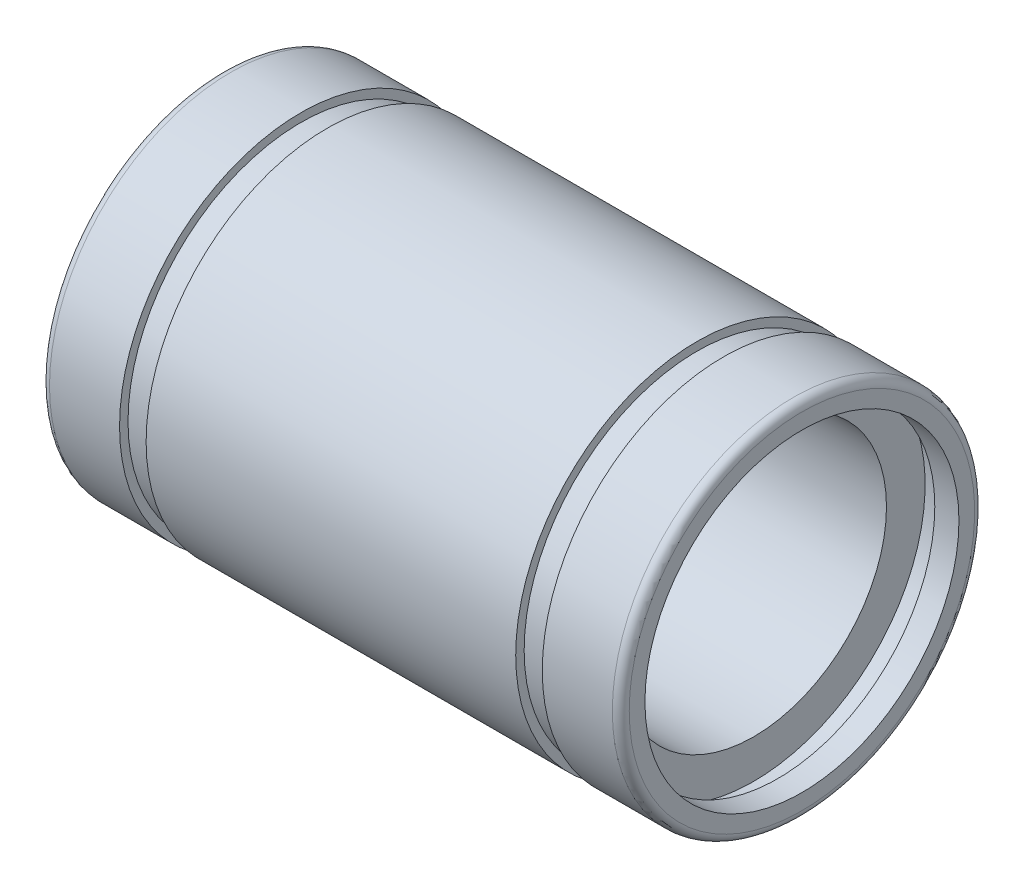
ISO-10303-21;
HEADER;
FILE_DESCRIPTION(('STEP AP214'),'2;1');
FILE_NAME('part.step','',(''),(''),'','','');
FILE_SCHEMA(('AUTOMOTIVE_DESIGN { 1 0 10303 214 1 1 1 1 }'));
ENDSEC;
DATA;
#1=APPLICATION_CONTEXT('core data for automotive mechanical design processes');
#2=APPLICATION_PROTOCOL_DEFINITION('international standard','automotive_design',2000,#1);
#3=PRODUCT_CONTEXT('',#1,'mechanical');
#4=PRODUCT('Part','Part','',(#3));
#5=PRODUCT_RELATED_PRODUCT_CATEGORY('part','',(#4));
#6=PRODUCT_DEFINITION_FORMATION('','',#4);
#7=PRODUCT_DEFINITION_CONTEXT('part definition',#1,'design');
#8=PRODUCT_DEFINITION('design','',#6,#7);
#9=PRODUCT_DEFINITION_SHAPE('','',#8);
#10=(LENGTH_UNIT() NAMED_UNIT(*) SI_UNIT(.MILLI.,.METRE.));
#11=(NAMED_UNIT(*) PLANE_ANGLE_UNIT() SI_UNIT($,.RADIAN.));
#12=(NAMED_UNIT(*) SI_UNIT($,.STERADIAN.) SOLID_ANGLE_UNIT());
#13=UNCERTAINTY_MEASURE_WITH_UNIT(LENGTH_MEASURE(1.E-05),#10,'distance_accuracy_value','');
#14=(GEOMETRIC_REPRESENTATION_CONTEXT(3) GLOBAL_UNCERTAINTY_ASSIGNED_CONTEXT((#13)) GLOBAL_UNIT_ASSIGNED_CONTEXT((#10,
#11,#12)) REPRESENTATION_CONTEXT('',''));
#15=CARTESIAN_POINT('',(0.,0.,0.));
#16=DIRECTION('',(0.,0.,1.));
#17=DIRECTION('',(1.,0.,0.));
#18=AXIS2_PLACEMENT_3D('',#15,#16,#17);
#19=CARTESIAN_POINT('',(23.65,0.,0.));
#20=DIRECTION('',(-1.,0.,0.));
#21=DIRECTION('',(0.,0.,1.));
#22=AXIS2_PLACEMENT_3D('',#19,#20,#21);
#23=TOROIDAL_SURFACE('',#22,7.15,0.35);
#24=CARTESIAN_POINT('',(23.65,0.,0.));
#25=DIRECTION('',(-1.,0.,0.));
#26=DIRECTION('',(0.,0.,1.));
#27=AXIS2_PLACEMENT_3D('',#24,#25,#26);
#28=CIRCLE('',#27,7.5);
#29=CARTESIAN_POINT('',(23.65,0.,7.5));
#30=VERTEX_POINT('',#29);
#31=EDGE_CURVE('E10',#30,#30,#28,.T.);
#32=ORIENTED_EDGE('',*,*,#31,.F.);
#33=EDGE_LOOP('',(#32));
#34=FACE_BOUND('',#33,.T.);
#35=CARTESIAN_POINT('',(24.,0.,0.));
#36=DIRECTION('',(-1.,0.,0.));
#37=DIRECTION('',(0.,0.,1.));
#38=AXIS2_PLACEMENT_3D('',#35,#36,#37);
#39=CIRCLE('',#38,7.15);
#40=CARTESIAN_POINT('',(24.,0.,7.15));
#41=VERTEX_POINT('',#40);
#42=EDGE_CURVE('E102',#41,#41,#39,.T.);
#43=ORIENTED_EDGE('',*,*,#42,.T.);
#44=EDGE_LOOP('',(#43));
#45=FACE_BOUND('',#44,.T.);
#46=ADVANCED_FACE('F32',(#34,#45),#23,.T.);
#47=CARTESIAN_POINT('',(0.,0.,0.));
#48=DIRECTION('',(-1.,0.,0.));
#49=DIRECTION('',(0.,0.,1.));
#50=AXIS2_PLACEMENT_3D('',#47,#48,#49);
#51=CYLINDRICAL_SURFACE('',#50,7.5);
#52=CARTESIAN_POINT('',(20.75,0.,0.));
#53=DIRECTION('',(-1.,0.,0.));
#54=DIRECTION('',(0.,0.,1.));
#55=AXIS2_PLACEMENT_3D('',#52,#53,#54);
#56=CIRCLE('',#55,7.5);
#57=CARTESIAN_POINT('',(20.75,0.,7.5));
#58=VERTEX_POINT('',#57);
#59=EDGE_CURVE('E38',#58,#58,#56,.T.);
#60=ORIENTED_EDGE('',*,*,#59,.F.);
#61=EDGE_LOOP('',(#60));
#62=FACE_BOUND('',#61,.T.);
#63=ORIENTED_EDGE('',*,*,#31,.T.);
#64=EDGE_LOOP('',(#63));
#65=FACE_BOUND('',#64,.T.);
#66=ADVANCED_FACE('F223',(#62,#65),#51,.T.);
#67=CARTESIAN_POINT('',(20.75,7.5,0.));
#68=DIRECTION('',(1.,0.,0.));
#69=DIRECTION('',(0.,0.,-1.));
#70=AXIS2_PLACEMENT_3D('',#67,#68,#69);
#71=PLANE('',#70);
#72=CARTESIAN_POINT('',(20.75,0.,0.));
#73=DIRECTION('',(-1.,0.,0.));
#74=DIRECTION('',(0.,0.,1.));
#75=AXIS2_PLACEMENT_3D('',#72,#73,#74);
#76=CIRCLE('',#75,7.15);
#77=CARTESIAN_POINT('',(20.75,0.,7.15));
#78=VERTEX_POINT('',#77);
#79=EDGE_CURVE('E42',#78,#78,#76,.T.);
#80=ORIENTED_EDGE('',*,*,#79,.F.);
#81=EDGE_LOOP('',(#80));
#82=FACE_BOUND('',#81,.T.);
#83=ORIENTED_EDGE('',*,*,#59,.T.);
#84=EDGE_LOOP('',(#83));
#85=FACE_BOUND('',#84,.T.);
#86=ADVANCED_FACE('F218',(#82,#85),#71,.F.);
#87=CARTESIAN_POINT('',(0.,0.,0.));
#88=DIRECTION('',(-1.,0.,0.));
#89=DIRECTION('',(0.,0.,1.));
#90=AXIS2_PLACEMENT_3D('',#87,#88,#89);
#91=CYLINDRICAL_SURFACE('',#90,7.15);
#92=CARTESIAN_POINT('',(19.65,0.,0.));
#93=DIRECTION('',(-1.,0.,0.));
#94=DIRECTION('',(0.,0.,1.));
#95=AXIS2_PLACEMENT_3D('',#92,#93,#94);
#96=CIRCLE('',#95,7.15);
#97=CARTESIAN_POINT('',(19.65,0.,7.15));
#98=VERTEX_POINT('',#97);
#99=EDGE_CURVE('E46',#98,#98,#96,.T.);
#100=ORIENTED_EDGE('',*,*,#99,.F.);
#101=EDGE_LOOP('',(#100));
#102=FACE_BOUND('',#101,.T.);
#103=ORIENTED_EDGE('',*,*,#79,.T.);
#104=EDGE_LOOP('',(#103));
#105=FACE_BOUND('',#104,.T.);
#106=ADVANCED_FACE('F212',(#102,#105),#91,.T.);
#107=CARTESIAN_POINT('',(19.65,7.15,0.));
#108=DIRECTION('',(-1.,0.,0.));
#109=DIRECTION('',(0.,0.,1.));
#110=AXIS2_PLACEMENT_3D('',#107,#108,#109);
#111=PLANE('',#110);
#112=CARTESIAN_POINT('',(19.65,0.,0.));
#113=DIRECTION('',(-1.,0.,0.));
#114=DIRECTION('',(0.,0.,1.));
#115=AXIS2_PLACEMENT_3D('',#112,#113,#114);
#116=CIRCLE('',#115,7.5);
#117=CARTESIAN_POINT('',(19.65,0.,7.5));
#118=VERTEX_POINT('',#117);
#119=EDGE_CURVE('E51',#118,#118,#116,.T.);
#120=ORIENTED_EDGE('',*,*,#119,.F.);
#121=EDGE_LOOP('',(#120));
#122=FACE_BOUND('',#121,.T.);
#123=ORIENTED_EDGE('',*,*,#99,.T.);
#124=EDGE_LOOP('',(#123));
#125=FACE_BOUND('',#124,.T.);
#126=ADVANCED_FACE('F206',(#122,#125),#111,.F.);
#127=CARTESIAN_POINT('',(0.,0.,0.));
#128=DIRECTION('',(-1.,0.,0.));
#129=DIRECTION('',(0.,0.,1.));
#130=AXIS2_PLACEMENT_3D('',#127,#128,#129);
#131=CYLINDRICAL_SURFACE('',#130,7.5);
#132=CARTESIAN_POINT('',(4.35,0.,0.));
#133=DIRECTION('',(-1.,0.,0.));
#134=DIRECTION('',(0.,0.,1.));
#135=AXIS2_PLACEMENT_3D('',#132,#133,#134);
#136=CIRCLE('',#135,7.5);
#137=CARTESIAN_POINT('',(4.35,0.,7.5));
#138=VERTEX_POINT('',#137);
#139=EDGE_CURVE('E54',#138,#138,#136,.T.);
#140=ORIENTED_EDGE('',*,*,#139,.F.);
#141=EDGE_LOOP('',(#140));
#142=FACE_BOUND('',#141,.T.);
#143=ORIENTED_EDGE('',*,*,#119,.T.);
#144=EDGE_LOOP('',(#143));
#145=FACE_BOUND('',#144,.T.);
#146=ADVANCED_FACE('F200',(#142,#145),#131,.T.);
#147=CARTESIAN_POINT('',(4.35,7.5,0.));
#148=DIRECTION('',(1.,0.,0.));
#149=DIRECTION('',(0.,0.,-1.));
#150=AXIS2_PLACEMENT_3D('',#147,#148,#149);
#151=PLANE('',#150);
#152=CARTESIAN_POINT('',(4.35,0.,0.));
#153=DIRECTION('',(-1.,0.,0.));
#154=DIRECTION('',(0.,0.,1.));
#155=AXIS2_PLACEMENT_3D('',#152,#153,#154);
#156=CIRCLE('',#155,7.15);
#157=CARTESIAN_POINT('',(4.35,0.,7.15));
#158=VERTEX_POINT('',#157);
#159=EDGE_CURVE('E57',#158,#158,#156,.T.);
#160=ORIENTED_EDGE('',*,*,#159,.F.);
#161=EDGE_LOOP('',(#160));
#162=FACE_BOUND('',#161,.T.);
#163=ORIENTED_EDGE('',*,*,#139,.T.);
#164=EDGE_LOOP('',(#163));
#165=FACE_BOUND('',#164,.T.);
#166=ADVANCED_FACE('F194',(#162,#165),#151,.F.);
#167=CARTESIAN_POINT('',(0.,0.,0.));
#168=DIRECTION('',(-1.,0.,0.));
#169=DIRECTION('',(0.,0.,1.));
#170=AXIS2_PLACEMENT_3D('',#167,#168,#169);
#171=CYLINDRICAL_SURFACE('',#170,7.15);
#172=CARTESIAN_POINT('',(3.25,0.,0.));
#173=DIRECTION('',(-1.,0.,0.));
#174=DIRECTION('',(0.,0.,1.));
#175=AXIS2_PLACEMENT_3D('',#172,#173,#174);
#176=CIRCLE('',#175,7.15);
#177=CARTESIAN_POINT('',(3.25,0.,7.15));
#178=VERTEX_POINT('',#177);
#179=EDGE_CURVE('E60',#178,#178,#176,.T.);
#180=ORIENTED_EDGE('',*,*,#179,.F.);
#181=EDGE_LOOP('',(#180));
#182=FACE_BOUND('',#181,.T.);
#183=ORIENTED_EDGE('',*,*,#159,.T.);
#184=EDGE_LOOP('',(#183));
#185=FACE_BOUND('',#184,.T.);
#186=ADVANCED_FACE('F188',(#182,#185),#171,.T.);
#187=CARTESIAN_POINT('',(3.25,7.15,0.));
#188=DIRECTION('',(-1.,0.,0.));
#189=DIRECTION('',(0.,0.,1.));
#190=AXIS2_PLACEMENT_3D('',#187,#188,#189);
#191=PLANE('',#190);
#192=CARTESIAN_POINT('',(3.25,0.,0.));
#193=DIRECTION('',(-1.,0.,0.));
#194=DIRECTION('',(0.,0.,1.));
#195=AXIS2_PLACEMENT_3D('',#192,#193,#194);
#196=CIRCLE('',#195,7.5);
#197=CARTESIAN_POINT('',(3.25,0.,7.5));
#198=VERTEX_POINT('',#197);
#199=EDGE_CURVE('E63',#198,#198,#196,.T.);
#200=ORIENTED_EDGE('',*,*,#199,.F.);
#201=EDGE_LOOP('',(#200));
#202=FACE_BOUND('',#201,.T.);
#203=ORIENTED_EDGE('',*,*,#179,.T.);
#204=EDGE_LOOP('',(#203));
#205=FACE_BOUND('',#204,.T.);
#206=ADVANCED_FACE('F182',(#202,#205),#191,.F.);
#207=CARTESIAN_POINT('',(0.,0.,0.));
#208=DIRECTION('',(-1.,0.,0.));
#209=DIRECTION('',(0.,0.,1.));
#210=AXIS2_PLACEMENT_3D('',#207,#208,#209);
#211=CYLINDRICAL_SURFACE('',#210,7.5);
#212=CARTESIAN_POINT('',(0.350000000000002,0.,0.));
#213=DIRECTION('',(-1.,0.,0.));
#214=DIRECTION('',(0.,0.,1.));
#215=AXIS2_PLACEMENT_3D('',#212,#213,#214);
#216=CIRCLE('',#215,7.5);
#217=CARTESIAN_POINT('',(0.350000000000002,0.,7.5));
#218=VERTEX_POINT('',#217);
#219=EDGE_CURVE('E66',#218,#218,#216,.T.);
#220=ORIENTED_EDGE('',*,*,#219,.F.);
#221=EDGE_LOOP('',(#220));
#222=FACE_BOUND('',#221,.T.);
#223=ORIENTED_EDGE('',*,*,#199,.T.);
#224=EDGE_LOOP('',(#223));
#225=FACE_BOUND('',#224,.T.);
#226=ADVANCED_FACE('F176',(#222,#225),#211,.T.);
#227=CARTESIAN_POINT('',(0.35,0.,0.));
#228=DIRECTION('',(-1.,0.,0.));
#229=DIRECTION('',(0.,0.,1.));
#230=AXIS2_PLACEMENT_3D('',#227,#228,#229);
#231=TOROIDAL_SURFACE('',#230,7.15,0.35);
#232=CARTESIAN_POINT('',(0.,0.,0.));
#233=DIRECTION('',(-1.,0.,0.));
#234=DIRECTION('',(0.,0.,1.));
#235=AXIS2_PLACEMENT_3D('',#232,#233,#234);
#236=CIRCLE('',#235,7.15);
#237=CARTESIAN_POINT('',(0.,0.,7.15));
#238=VERTEX_POINT('',#237);
#239=EDGE_CURVE('E69',#238,#238,#236,.T.);
#240=ORIENTED_EDGE('',*,*,#239,.F.);
#241=EDGE_LOOP('',(#240));
#242=FACE_BOUND('',#241,.T.);
#243=ORIENTED_EDGE('',*,*,#219,.T.);
#244=EDGE_LOOP('',(#243));
#245=FACE_BOUND('',#244,.T.);
#246=ADVANCED_FACE('F170',(#242,#245),#231,.T.);
#247=CARTESIAN_POINT('',(0.,7.15,0.));
#248=DIRECTION('',(1.,0.,0.));
#249=DIRECTION('',(0.,0.,-1.));
#250=AXIS2_PLACEMENT_3D('',#247,#248,#249);
#251=PLANE('',#250);
#252=CARTESIAN_POINT('',(0.,0.,0.));
#253=DIRECTION('',(-1.,0.,0.));
#254=DIRECTION('',(0.,0.,1.));
#255=AXIS2_PLACEMENT_3D('',#252,#253,#254);
#256=CIRCLE('',#255,6.5);
#257=CARTESIAN_POINT('',(0.,0.,6.5));
#258=VERTEX_POINT('',#257);
#259=EDGE_CURVE('E72',#258,#258,#256,.T.);
#260=ORIENTED_EDGE('',*,*,#259,.F.);
#261=EDGE_LOOP('',(#260));
#262=FACE_BOUND('',#261,.T.);
#263=ORIENTED_EDGE('',*,*,#239,.T.);
#264=EDGE_LOOP('',(#263));
#265=FACE_BOUND('',#264,.T.);
#266=ADVANCED_FACE('F164',(#262,#265),#251,.F.);
#267=CARTESIAN_POINT('',(0.,0.,0.));
#268=DIRECTION('',(-1.,0.,0.));
#269=DIRECTION('',(0.,0.,1.));
#270=AXIS2_PLACEMENT_3D('',#267,#268,#269);
#271=CYLINDRICAL_SURFACE('',#270,6.5);
#272=CARTESIAN_POINT('',(1.,0.,0.));
#273=DIRECTION('',(-1.,0.,0.));
#274=DIRECTION('',(0.,0.,1.));
#275=AXIS2_PLACEMENT_3D('',#272,#273,#274);
#276=CIRCLE('',#275,6.5);
#277=CARTESIAN_POINT('',(1.,0.,6.5));
#278=VERTEX_POINT('',#277);
#279=EDGE_CURVE('E75',#278,#278,#276,.T.);
#280=ORIENTED_EDGE('',*,*,#279,.F.);
#281=EDGE_LOOP('',(#280));
#282=FACE_BOUND('',#281,.T.);
#283=ORIENTED_EDGE('',*,*,#259,.T.);
#284=EDGE_LOOP('',(#283));
#285=FACE_BOUND('',#284,.T.);
#286=ADVANCED_FACE('F158',(#282,#285),#271,.F.);
#287=CARTESIAN_POINT('',(1.,6.8,0.));
#288=DIRECTION('',(-1.,0.,0.));
#289=DIRECTION('',(0.,0.,1.));
#290=AXIS2_PLACEMENT_3D('',#287,#288,#289);
#291=PLANE('',#290);
#292=CARTESIAN_POINT('',(1.,0.,0.));
#293=DIRECTION('',(-1.,0.,0.));
#294=DIRECTION('',(0.,0.,1.));
#295=AXIS2_PLACEMENT_3D('',#292,#293,#294);
#296=CIRCLE('',#295,6.8);
#297=CARTESIAN_POINT('',(1.,0.,6.8));
#298=VERTEX_POINT('',#297);
#299=EDGE_CURVE('E78',#298,#298,#296,.T.);
#300=ORIENTED_EDGE('',*,*,#299,.F.);
#301=EDGE_LOOP('',(#300));
#302=FACE_BOUND('',#301,.T.);
#303=ORIENTED_EDGE('',*,*,#279,.T.);
#304=EDGE_LOOP('',(#303));
#305=FACE_BOUND('',#304,.T.);
#306=ADVANCED_FACE('F152',(#302,#305),#291,.F.);
#307=CARTESIAN_POINT('',(0.,0.,0.));
#308=DIRECTION('',(-1.,0.,0.));
#309=DIRECTION('',(0.,0.,1.));
#310=AXIS2_PLACEMENT_3D('',#307,#308,#309);
#311=CYLINDRICAL_SURFACE('',#310,6.8);
#312=CARTESIAN_POINT('',(2.,0.,0.));
#313=DIRECTION('',(-1.,0.,0.));
#314=DIRECTION('',(0.,0.,1.));
#315=AXIS2_PLACEMENT_3D('',#312,#313,#314);
#316=CIRCLE('',#315,6.8);
#317=CARTESIAN_POINT('',(2.,0.,6.8));
#318=VERTEX_POINT('',#317);
#319=EDGE_CURVE('E81',#318,#318,#316,.T.);
#320=ORIENTED_EDGE('',*,*,#319,.F.);
#321=EDGE_LOOP('',(#320));
#322=FACE_BOUND('',#321,.T.);
#323=ORIENTED_EDGE('',*,*,#299,.T.);
#324=EDGE_LOOP('',(#323));
#325=FACE_BOUND('',#324,.T.);
#326=ADVANCED_FACE('F146',(#322,#325),#311,.F.);
#327=CARTESIAN_POINT('',(2.,6.8,0.));
#328=DIRECTION('',(1.,0.,0.));
#329=DIRECTION('',(0.,0.,-1.));
#330=AXIS2_PLACEMENT_3D('',#327,#328,#329);
#331=PLANE('',#330);
#332=CARTESIAN_POINT('',(2.,0.,0.));
#333=DIRECTION('',(-1.,0.,0.));
#334=DIRECTION('',(0.,0.,1.));
#335=AXIS2_PLACEMENT_3D('',#332,#333,#334);
#336=CIRCLE('',#335,5.5);
#337=CARTESIAN_POINT('',(2.,0.,5.5));
#338=VERTEX_POINT('',#337);
#339=EDGE_CURVE('E84',#338,#338,#336,.T.);
#340=ORIENTED_EDGE('',*,*,#339,.F.);
#341=EDGE_LOOP('',(#340));
#342=FACE_BOUND('',#341,.T.);
#343=ORIENTED_EDGE('',*,*,#319,.T.);
#344=EDGE_LOOP('',(#343));
#345=FACE_BOUND('',#344,.T.);
#346=ADVANCED_FACE('F140',(#342,#345),#331,.F.);
#347=CARTESIAN_POINT('',(0.,0.,0.));
#348=DIRECTION('',(-1.,0.,0.));
#349=DIRECTION('',(0.,0.,1.));
#350=AXIS2_PLACEMENT_3D('',#347,#348,#349);
#351=CYLINDRICAL_SURFACE('',#350,5.5);
#352=CARTESIAN_POINT('',(22.,0.,0.));
#353=DIRECTION('',(-1.,0.,0.));
#354=DIRECTION('',(0.,0.,1.));
#355=AXIS2_PLACEMENT_3D('',#352,#353,#354);
#356=CIRCLE('',#355,5.5);
#357=CARTESIAN_POINT('',(22.,0.,5.5));
#358=VERTEX_POINT('',#357);
#359=EDGE_CURVE('E87',#358,#358,#356,.T.);
#360=ORIENTED_EDGE('',*,*,#359,.F.);
#361=EDGE_LOOP('',(#360));
#362=FACE_BOUND('',#361,.T.);
#363=ORIENTED_EDGE('',*,*,#339,.T.);
#364=EDGE_LOOP('',(#363));
#365=FACE_BOUND('',#364,.T.);
#366=ADVANCED_FACE('F134',(#362,#365),#351,.F.);
#367=CARTESIAN_POINT('',(22.,5.5,0.));
#368=DIRECTION('',(-1.,0.,0.));
#369=DIRECTION('',(0.,0.,1.));
#370=AXIS2_PLACEMENT_3D('',#367,#368,#369);
#371=PLANE('',#370);
#372=CARTESIAN_POINT('',(22.,0.,0.));
#373=DIRECTION('',(-1.,0.,0.));
#374=DIRECTION('',(0.,0.,1.));
#375=AXIS2_PLACEMENT_3D('',#372,#373,#374);
#376=CIRCLE('',#375,7.1);
#377=CARTESIAN_POINT('',(22.,0.,7.1));
#378=VERTEX_POINT('',#377);
#379=EDGE_CURVE('E90',#378,#378,#376,.T.);
#380=ORIENTED_EDGE('',*,*,#379,.F.);
#381=EDGE_LOOP('',(#380));
#382=FACE_BOUND('',#381,.T.);
#383=ORIENTED_EDGE('',*,*,#359,.T.);
#384=EDGE_LOOP('',(#383));
#385=FACE_BOUND('',#384,.T.);
#386=ADVANCED_FACE('F128',(#382,#385),#371,.F.);
#387=CARTESIAN_POINT('',(0.,0.,0.));
#388=DIRECTION('',(-1.,0.,0.));
#389=DIRECTION('',(0.,0.,1.));
#390=AXIS2_PLACEMENT_3D('',#387,#388,#389);
#391=CYLINDRICAL_SURFACE('',#390,7.1);
#392=CARTESIAN_POINT('',(23.,0.,0.));
#393=DIRECTION('',(-1.,0.,0.));
#394=DIRECTION('',(0.,0.,1.));
#395=AXIS2_PLACEMENT_3D('',#392,#393,#394);
#396=CIRCLE('',#395,7.1);
#397=CARTESIAN_POINT('',(23.,0.,7.1));
#398=VERTEX_POINT('',#397);
#399=EDGE_CURVE('E93',#398,#398,#396,.T.);
#400=ORIENTED_EDGE('',*,*,#399,.F.);
#401=EDGE_LOOP('',(#400));
#402=FACE_BOUND('',#401,.T.);
#403=ORIENTED_EDGE('',*,*,#379,.T.);
#404=EDGE_LOOP('',(#403));
#405=FACE_BOUND('',#404,.T.);
#406=ADVANCED_FACE('F122',(#402,#405),#391,.F.);
#407=CARTESIAN_POINT('',(23.,7.1,0.));
#408=DIRECTION('',(1.,0.,0.));
#409=DIRECTION('',(0.,0.,-1.));
#410=AXIS2_PLACEMENT_3D('',#407,#408,#409);
#411=PLANE('',#410);
#412=CARTESIAN_POINT('',(23.,0.,0.));
#413=DIRECTION('',(-1.,0.,0.));
#414=DIRECTION('',(0.,0.,1.));
#415=AXIS2_PLACEMENT_3D('',#412,#413,#414);
#416=CIRCLE('',#415,6.5);
#417=CARTESIAN_POINT('',(23.,0.,6.5));
#418=VERTEX_POINT('',#417);
#419=EDGE_CURVE('E96',#418,#418,#416,.T.);
#420=ORIENTED_EDGE('',*,*,#419,.F.);
#421=EDGE_LOOP('',(#420));
#422=FACE_BOUND('',#421,.T.);
#423=ORIENTED_EDGE('',*,*,#399,.T.);
#424=EDGE_LOOP('',(#423));
#425=FACE_BOUND('',#424,.T.);
#426=ADVANCED_FACE('F116',(#422,#425),#411,.F.);
#427=CARTESIAN_POINT('',(0.,0.,0.));
#428=DIRECTION('',(-1.,0.,0.));
#429=DIRECTION('',(0.,0.,1.));
#430=AXIS2_PLACEMENT_3D('',#427,#428,#429);
#431=CYLINDRICAL_SURFACE('',#430,6.5);
#432=CARTESIAN_POINT('',(24.,0.,0.));
#433=DIRECTION('',(-1.,0.,0.));
#434=DIRECTION('',(0.,0.,1.));
#435=AXIS2_PLACEMENT_3D('',#432,#433,#434);
#436=CIRCLE('',#435,6.5);
#437=CARTESIAN_POINT('',(24.,0.,6.5));
#438=VERTEX_POINT('',#437);
#439=EDGE_CURVE('E99',#438,#438,#436,.T.);
#440=ORIENTED_EDGE('',*,*,#439,.F.);
#441=EDGE_LOOP('',(#440));
#442=FACE_BOUND('',#441,.T.);
#443=ORIENTED_EDGE('',*,*,#419,.T.);
#444=EDGE_LOOP('',(#443));
#445=FACE_BOUND('',#444,.T.);
#446=ADVANCED_FACE('F110',(#442,#445),#431,.F.);
#447=CARTESIAN_POINT('',(24.,7.15,0.));
#448=DIRECTION('',(-1.,0.,0.));
#449=DIRECTION('',(0.,0.,1.));
#450=AXIS2_PLACEMENT_3D('',#447,#448,#449);
#451=PLANE('',#450);
#452=ORIENTED_EDGE('',*,*,#42,.F.);
#453=EDGE_LOOP('',(#452));
#454=FACE_BOUND('',#453,.T.);
#455=ORIENTED_EDGE('',*,*,#439,.T.);
#456=EDGE_LOOP('',(#455));
#457=FACE_BOUND('',#456,.T.);
#458=ADVANCED_FACE('F107',(#454,#457),#451,.F.);
#459=CLOSED_SHELL('',(#46,#66,#86,#106,#126,#146,#166,#186,#206,#226,#246,#266,#286,#306,#326,
#346,#366,#386,#406,#426,#446,#458));
#460=MANIFOLD_SOLID_BREP('B2',#459);
#461=ADVANCED_BREP_SHAPE_REPRESENTATION('',(#18,#460),#14);
#462=SHAPE_DEFINITION_REPRESENTATION(#9,#461);
ENDSEC;
END-ISO-10303-21;
